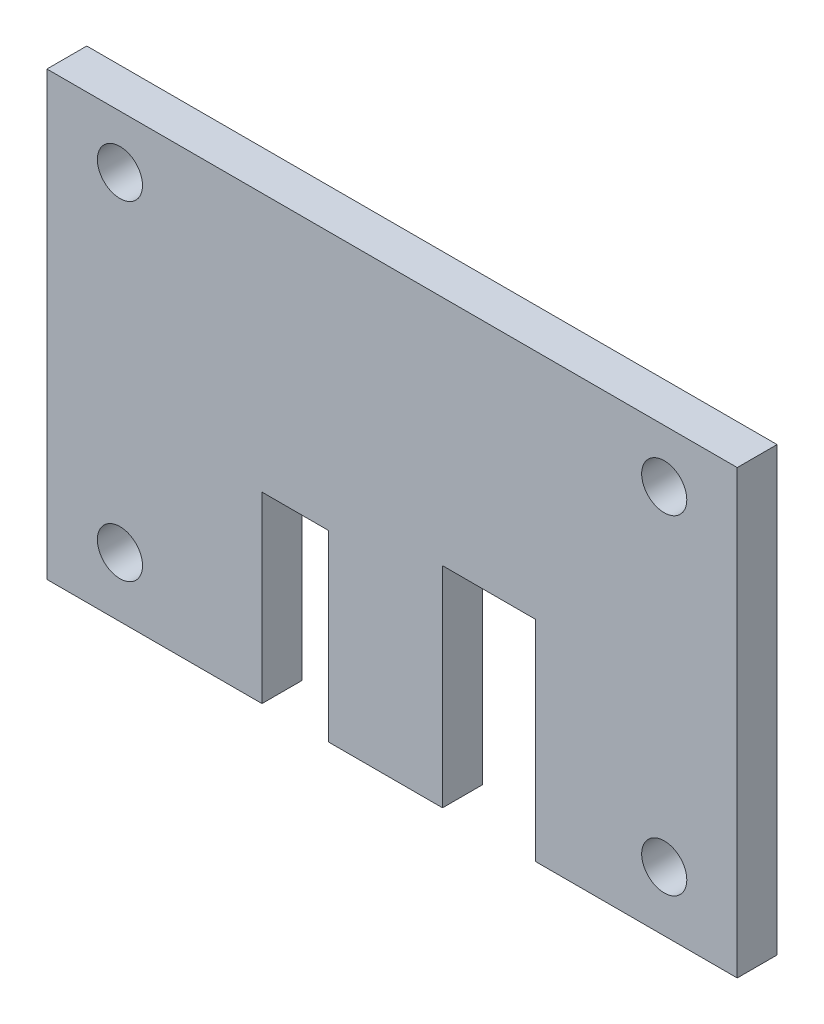
ISO-10303-21;
HEADER;
FILE_DESCRIPTION(('STEP AP214'),'2;1');
FILE_NAME('part.step','',(''),(''),'','','');
FILE_SCHEMA(('AUTOMOTIVE_DESIGN { 1 0 10303 214 1 1 1 1 }'));
ENDSEC;
DATA;
#1=APPLICATION_CONTEXT('core data for automotive mechanical design processes');
#2=APPLICATION_PROTOCOL_DEFINITION('international standard','automotive_design',2000,#1);
#3=PRODUCT_CONTEXT('',#1,'mechanical');
#4=PRODUCT('Part','Part','',(#3));
#5=PRODUCT_RELATED_PRODUCT_CATEGORY('part','',(#4));
#6=PRODUCT_DEFINITION_FORMATION('','',#4);
#7=PRODUCT_DEFINITION_CONTEXT('part definition',#1,'design');
#8=PRODUCT_DEFINITION('design','',#6,#7);
#9=PRODUCT_DEFINITION_SHAPE('','',#8);
#10=(LENGTH_UNIT() NAMED_UNIT(*) SI_UNIT(.MILLI.,.METRE.));
#11=(NAMED_UNIT(*) PLANE_ANGLE_UNIT() SI_UNIT($,.RADIAN.));
#12=(NAMED_UNIT(*) SI_UNIT($,.STERADIAN.) SOLID_ANGLE_UNIT());
#13=UNCERTAINTY_MEASURE_WITH_UNIT(LENGTH_MEASURE(1.E-05),#10,'distance_accuracy_value','');
#14=(GEOMETRIC_REPRESENTATION_CONTEXT(3) GLOBAL_UNCERTAINTY_ASSIGNED_CONTEXT((#13)) GLOBAL_UNIT_ASSIGNED_CONTEXT((#10,
#11,#12)) REPRESENTATION_CONTEXT('',''));
#15=CARTESIAN_POINT('',(0.,0.,0.));
#16=DIRECTION('',(0.,0.,1.));
#17=DIRECTION('',(1.,0.,0.));
#18=AXIS2_PLACEMENT_3D('',#15,#16,#17);
#19=CARTESIAN_POINT('',(-62.5,-26.8,127.4));
#20=DIRECTION('',(0.,1.,0.));
#21=DIRECTION('',(0.,0.,1.));
#22=AXIS2_PLACEMENT_3D('',#19,#20,#21);
#23=PLANE('',#22);
#24=DIRECTION('',(0.,0.,-1.));
#25=VECTOR('',#24,1.);
#26=CARTESIAN_POINT('',(-46.3,-26.8,127.4));
#27=LINE('',#26,#25);
#28=CARTESIAN_POINT('',(-46.3,-26.8,127.4));
#29=VERTEX_POINT('',#28);
#30=CARTESIAN_POINT('',(-46.3,-26.8,124.4));
#31=VERTEX_POINT('',#30);
#32=EDGE_CURVE('E165',#29,#31,#27,.T.);
#33=ORIENTED_EDGE('',*,*,#32,.F.);
#34=DIRECTION('',(1.,0.,0.));
#35=VECTOR('',#34,1.);
#36=CARTESIAN_POINT('',(-62.5,-26.8,127.4));
#37=LINE('',#36,#35);
#38=CARTESIAN_POINT('',(-62.5,-26.8,127.4));
#39=VERTEX_POINT('',#38);
#40=EDGE_CURVE('E176',#39,#29,#37,.T.);
#41=ORIENTED_EDGE('',*,*,#40,.F.);
#42=DIRECTION('',(0.,0.,-1.));
#43=VECTOR('',#42,1.);
#44=CARTESIAN_POINT('',(-62.5,-26.8,127.4));
#45=LINE('',#44,#43);
#46=CARTESIAN_POINT('',(-62.5,-26.8,124.4));
#47=VERTEX_POINT('',#46);
#48=EDGE_CURVE('E201',#39,#47,#45,.T.);
#49=ORIENTED_EDGE('',*,*,#48,.T.);
#50=DIRECTION('',(1.,0.,0.));
#51=VECTOR('',#50,1.);
#52=CARTESIAN_POINT('',(-62.5,-26.8,124.4));
#53=LINE('',#52,#51);
#54=EDGE_CURVE('E186',#47,#31,#53,.T.);
#55=ORIENTED_EDGE('',*,*,#54,.T.);
#56=EDGE_LOOP('',(#33,#41,#49,#55));
#57=FACE_BOUND('',#56,.T.);
#58=ADVANCED_FACE('F39',(#57),#23,.F.);
#59=DIRECTION('',(0.,0.,1.));
#60=VECTOR('',#59,1.);
#61=CARTESIAN_POINT('',(-41.3,-26.8,127.4));
#62=LINE('',#61,#60);
#63=CARTESIAN_POINT('',(-41.3,-26.8,124.4));
#64=VERTEX_POINT('',#63);
#65=CARTESIAN_POINT('',(-41.3,-26.8,127.4));
#66=VERTEX_POINT('',#65);
#67=EDGE_CURVE('E156',#64,#66,#62,.T.);
#68=ORIENTED_EDGE('',*,*,#67,.F.);
#69=CARTESIAN_POINT('',(-32.7,-26.8,124.4));
#70=VERTEX_POINT('',#69);
#71=EDGE_CURVE('E190',#64,#70,#53,.T.);
#72=ORIENTED_EDGE('',*,*,#71,.T.);
#73=DIRECTION('',(0.,0.,-1.));
#74=VECTOR('',#73,1.);
#75=CARTESIAN_POINT('',(-32.7,-26.8,127.4));
#76=LINE('',#75,#74);
#77=CARTESIAN_POINT('',(-32.7,-26.8,127.4));
#78=VERTEX_POINT('',#77);
#79=EDGE_CURVE('E153',#78,#70,#76,.T.);
#80=ORIENTED_EDGE('',*,*,#79,.F.);
#81=EDGE_CURVE('E151',#66,#78,#37,.T.);
#82=ORIENTED_EDGE('',*,*,#81,.F.);
#83=EDGE_LOOP('',(#68,#72,#80,#82));
#84=FACE_BOUND('',#83,.T.);
#85=ADVANCED_FACE('F276',(#84),#23,.F.);
#86=DIRECTION('',(0.,0.,1.));
#87=VECTOR('',#86,1.);
#88=CARTESIAN_POINT('',(-25.7,-26.8,127.4));
#89=LINE('',#88,#87);
#90=CARTESIAN_POINT('',(-25.7,-26.8,124.4));
#91=VERTEX_POINT('',#90);
#92=CARTESIAN_POINT('',(-25.7,-26.8,127.4));
#93=VERTEX_POINT('',#92);
#94=EDGE_CURVE('E135',#91,#93,#89,.T.);
#95=ORIENTED_EDGE('',*,*,#94,.F.);
#96=CARTESIAN_POINT('',(-10.5,-26.8,124.4));
#97=VERTEX_POINT('',#96);
#98=EDGE_CURVE('E185',#91,#97,#53,.T.);
#99=ORIENTED_EDGE('',*,*,#98,.T.);
#100=DIRECTION('',(0.,0.,-1.));
#101=VECTOR('',#100,1.);
#102=CARTESIAN_POINT('',(-10.5,-26.8,127.4));
#103=LINE('',#102,#101);
#104=CARTESIAN_POINT('',(-10.5,-26.8,127.4));
#105=VERTEX_POINT('',#104);
#106=EDGE_CURVE('E198',#105,#97,#103,.T.);
#107=ORIENTED_EDGE('',*,*,#106,.F.);
#108=EDGE_CURVE('E174',#93,#105,#37,.T.);
#109=ORIENTED_EDGE('',*,*,#108,.F.);
#110=EDGE_LOOP('',(#95,#99,#107,#109));
#111=FACE_BOUND('',#110,.T.);
#112=ADVANCED_FACE('F244',(#111),#23,.F.);
#113=CARTESIAN_POINT('',(0.,0.,127.4));
#114=DIRECTION('',(0.,0.,1.));
#115=DIRECTION('',(1.,0.,0.));
#116=AXIS2_PLACEMENT_3D('',#113,#114,#115);
#117=PLANE('',#116);
#118=CARTESIAN_POINT('',(-57.,2.5,127.4));
#119=DIRECTION('',(0.,0.,1.));
#120=DIRECTION('',(1.,0.,0.));
#121=AXIS2_PLACEMENT_3D('',#118,#119,#120);
#122=CIRCLE('',#121,1.7);
#123=CARTESIAN_POINT('',(-55.3,2.5,127.4));
#124=VERTEX_POINT('',#123);
#125=EDGE_CURVE('E232',#124,#124,#122,.F.);
#126=ORIENTED_EDGE('',*,*,#125,.T.);
#127=EDGE_LOOP('',(#126));
#128=FACE_BOUND('',#127,.T.);
#129=CARTESIAN_POINT('',(-16.,-22.3,127.4));
#130=DIRECTION('',(0.,0.,1.));
#131=DIRECTION('',(1.,0.,0.));
#132=AXIS2_PLACEMENT_3D('',#129,#130,#131);
#133=CIRCLE('',#132,1.7);
#134=CARTESIAN_POINT('',(-14.3,-22.3,127.4));
#135=VERTEX_POINT('',#134);
#136=EDGE_CURVE('E221',#135,#135,#133,.F.);
#137=ORIENTED_EDGE('',*,*,#136,.T.);
#138=EDGE_LOOP('',(#137));
#139=FACE_BOUND('',#138,.T.);
#140=CARTESIAN_POINT('',(-16.,2.5,127.4));
#141=DIRECTION('',(0.,0.,1.));
#142=DIRECTION('',(1.,0.,0.));
#143=AXIS2_PLACEMENT_3D('',#140,#141,#142);
#144=CIRCLE('',#143,1.7);
#145=CARTESIAN_POINT('',(-14.3,2.5,127.4));
#146=VERTEX_POINT('',#145);
#147=EDGE_CURVE('E218',#146,#146,#144,.F.);
#148=ORIENTED_EDGE('',*,*,#147,.T.);
#149=EDGE_LOOP('',(#148));
#150=FACE_BOUND('',#149,.T.);
#151=CARTESIAN_POINT('',(-57.,-22.3,127.4));
#152=DIRECTION('',(0.,0.,1.));
#153=DIRECTION('',(1.,0.,0.));
#154=AXIS2_PLACEMENT_3D('',#151,#152,#153);
#155=CIRCLE('',#154,1.7);
#156=CARTESIAN_POINT('',(-55.3,-22.3,127.4));
#157=VERTEX_POINT('',#156);
#158=EDGE_CURVE('E215',#157,#157,#155,.F.);
#159=ORIENTED_EDGE('',*,*,#158,.T.);
#160=EDGE_LOOP('',(#159));
#161=FACE_BOUND('',#160,.T.);
#162=ORIENTED_EDGE('',*,*,#40,.T.);
#163=DIRECTION('',(0.,1.,0.));
#164=VECTOR('',#163,1.);
#165=CARTESIAN_POINT('',(-46.3,0.,127.4));
#166=LINE('',#165,#164);
#167=CARTESIAN_POINT('',(-46.3,-13.,127.4));
#168=VERTEX_POINT('',#167);
#169=EDGE_CURVE('E167',#29,#168,#166,.T.);
#170=ORIENTED_EDGE('',*,*,#169,.T.);
#171=DIRECTION('',(1.,0.,0.));
#172=VECTOR('',#171,1.);
#173=CARTESIAN_POINT('',(0.,-13.,127.4));
#174=LINE('',#173,#172);
#175=CARTESIAN_POINT('',(-41.3,-13.,127.4));
#176=VERTEX_POINT('',#175);
#177=EDGE_CURVE('E152',#168,#176,#174,.T.);
#178=ORIENTED_EDGE('',*,*,#177,.T.);
#179=DIRECTION('',(0.,-1.,0.));
#180=VECTOR('',#179,1.);
#181=CARTESIAN_POINT('',(-41.3,0.,127.4));
#182=LINE('',#181,#180);
#183=EDGE_CURVE('E163',#176,#66,#182,.T.);
#184=ORIENTED_EDGE('',*,*,#183,.T.);
#185=ORIENTED_EDGE('',*,*,#81,.T.);
#186=DIRECTION('',(0.,1.,0.));
#187=VECTOR('',#186,1.);
#188=CARTESIAN_POINT('',(-32.7,0.,127.4));
#189=LINE('',#188,#187);
#190=CARTESIAN_POINT('',(-32.7,-11.,127.4));
#191=VERTEX_POINT('',#190);
#192=EDGE_CURVE('E140',#78,#191,#189,.T.);
#193=ORIENTED_EDGE('',*,*,#192,.T.);
#194=DIRECTION('',(1.,0.,0.));
#195=VECTOR('',#194,1.);
#196=CARTESIAN_POINT('',(0.,-11.,127.4));
#197=LINE('',#196,#195);
#198=CARTESIAN_POINT('',(-25.7,-11.,127.4));
#199=VERTEX_POINT('',#198);
#200=EDGE_CURVE('E128',#191,#199,#197,.T.);
#201=ORIENTED_EDGE('',*,*,#200,.T.);
#202=DIRECTION('',(0.,-1.,0.));
#203=VECTOR('',#202,1.);
#204=CARTESIAN_POINT('',(-25.7,0.,127.4));
#205=LINE('',#204,#203);
#206=EDGE_CURVE('E158',#199,#93,#205,.T.);
#207=ORIENTED_EDGE('',*,*,#206,.T.);
#208=ORIENTED_EDGE('',*,*,#108,.T.);
#209=DIRECTION('',(0.,1.,0.));
#210=VECTOR('',#209,1.);
#211=CARTESIAN_POINT('',(-10.5,-26.8,127.4));
#212=LINE('',#211,#210);
#213=CARTESIAN_POINT('',(-10.5,6.5,127.4));
#214=VERTEX_POINT('',#213);
#215=EDGE_CURVE('E178',#105,#214,#212,.T.);
#216=ORIENTED_EDGE('',*,*,#215,.T.);
#217=DIRECTION('',(-1.,0.,0.));
#218=VECTOR('',#217,1.);
#219=CARTESIAN_POINT('',(-10.5,6.5,127.4));
#220=LINE('',#219,#218);
#221=CARTESIAN_POINT('',(-62.5,6.5,127.4));
#222=VERTEX_POINT('',#221);
#223=EDGE_CURVE('E180',#214,#222,#220,.T.);
#224=ORIENTED_EDGE('',*,*,#223,.T.);
#225=DIRECTION('',(0.,-1.,0.));
#226=VECTOR('',#225,1.);
#227=CARTESIAN_POINT('',(-62.5,6.5,127.4));
#228=LINE('',#227,#226);
#229=EDGE_CURVE('E171',#222,#39,#228,.T.);
#230=ORIENTED_EDGE('',*,*,#229,.T.);
#231=EDGE_LOOP('',(#162,#170,#178,#184,#185,#193,#201,#207,#208,#216,#224,#230));
#232=FACE_BOUND('',#231,.T.);
#233=ADVANCED_FACE('F148',(#128,#139,#150,#161,#232),#117,.T.);
#234=CARTESIAN_POINT('',(0.,0.,124.4));
#235=DIRECTION('',(0.,0.,1.));
#236=DIRECTION('',(1.,0.,0.));
#237=AXIS2_PLACEMENT_3D('',#234,#235,#236);
#238=PLANE('',#237);
#239=CARTESIAN_POINT('',(-57.,2.5,124.4));
#240=DIRECTION('',(0.,0.,1.));
#241=DIRECTION('',(1.,0.,0.));
#242=AXIS2_PLACEMENT_3D('',#239,#240,#241);
#243=CIRCLE('',#242,1.7);
#244=CARTESIAN_POINT('',(-55.3,2.5,124.4));
#245=VERTEX_POINT('',#244);
#246=EDGE_CURVE('E43',#245,#245,#243,.F.);
#247=ORIENTED_EDGE('',*,*,#246,.F.);
#248=EDGE_LOOP('',(#247));
#249=FACE_BOUND('',#248,.T.);
#250=CARTESIAN_POINT('',(-16.,-22.3,124.4));
#251=DIRECTION('',(0.,0.,1.));
#252=DIRECTION('',(1.,0.,0.));
#253=AXIS2_PLACEMENT_3D('',#250,#251,#252);
#254=CIRCLE('',#253,1.7);
#255=CARTESIAN_POINT('',(-14.3,-22.3,124.4));
#256=VERTEX_POINT('',#255);
#257=EDGE_CURVE('E219',#256,#256,#254,.F.);
#258=ORIENTED_EDGE('',*,*,#257,.F.);
#259=EDGE_LOOP('',(#258));
#260=FACE_BOUND('',#259,.T.);
#261=CARTESIAN_POINT('',(-16.,2.5,124.4));
#262=DIRECTION('',(0.,0.,1.));
#263=DIRECTION('',(1.,0.,0.));
#264=AXIS2_PLACEMENT_3D('',#261,#262,#263);
#265=CIRCLE('',#264,1.7);
#266=CARTESIAN_POINT('',(-14.3,2.5,124.4));
#267=VERTEX_POINT('',#266);
#268=EDGE_CURVE('E216',#267,#267,#265,.F.);
#269=ORIENTED_EDGE('',*,*,#268,.F.);
#270=EDGE_LOOP('',(#269));
#271=FACE_BOUND('',#270,.T.);
#272=CARTESIAN_POINT('',(-57.,-22.3,124.4));
#273=DIRECTION('',(0.,0.,1.));
#274=DIRECTION('',(1.,0.,0.));
#275=AXIS2_PLACEMENT_3D('',#272,#273,#274);
#276=CIRCLE('',#275,1.7);
#277=CARTESIAN_POINT('',(-55.3,-22.3,124.4));
#278=VERTEX_POINT('',#277);
#279=EDGE_CURVE('E212',#278,#278,#276,.F.);
#280=ORIENTED_EDGE('',*,*,#279,.F.);
#281=EDGE_LOOP('',(#280));
#282=FACE_BOUND('',#281,.T.);
#283=DIRECTION('',(0.,1.,0.));
#284=VECTOR('',#283,1.);
#285=CARTESIAN_POINT('',(-46.3,0.,124.4));
#286=LINE('',#285,#284);
#287=CARTESIAN_POINT('',(-46.3,-13.,124.4));
#288=VERTEX_POINT('',#287);
#289=EDGE_CURVE('E11',#31,#288,#286,.T.);
#290=ORIENTED_EDGE('',*,*,#289,.F.);
#291=ORIENTED_EDGE('',*,*,#54,.F.);
#292=DIRECTION('',(0.,-1.,0.));
#293=VECTOR('',#292,1.);
#294=CARTESIAN_POINT('',(-62.5,6.5,124.4));
#295=LINE('',#294,#293);
#296=CARTESIAN_POINT('',(-62.5,6.5,124.4));
#297=VERTEX_POINT('',#296);
#298=EDGE_CURVE('E170',#297,#47,#295,.T.);
#299=ORIENTED_EDGE('',*,*,#298,.F.);
#300=DIRECTION('',(-1.,0.,0.));
#301=VECTOR('',#300,1.);
#302=CARTESIAN_POINT('',(-10.5,6.5,124.4));
#303=LINE('',#302,#301);
#304=CARTESIAN_POINT('',(-10.5,6.5,124.4));
#305=VERTEX_POINT('',#304);
#306=EDGE_CURVE('E175',#305,#297,#303,.T.);
#307=ORIENTED_EDGE('',*,*,#306,.F.);
#308=DIRECTION('',(0.,1.,0.));
#309=VECTOR('',#308,1.);
#310=CARTESIAN_POINT('',(-10.5,-26.8,124.4));
#311=LINE('',#310,#309);
#312=EDGE_CURVE('E189',#97,#305,#311,.T.);
#313=ORIENTED_EDGE('',*,*,#312,.F.);
#314=ORIENTED_EDGE('',*,*,#98,.F.);
#315=DIRECTION('',(0.,-1.,0.));
#316=VECTOR('',#315,1.);
#317=CARTESIAN_POINT('',(-25.7,0.,124.4));
#318=LINE('',#317,#316);
#319=CARTESIAN_POINT('',(-25.7,-11.,124.4));
#320=VERTEX_POINT('',#319);
#321=EDGE_CURVE('E206',#320,#91,#318,.T.);
#322=ORIENTED_EDGE('',*,*,#321,.F.);
#323=DIRECTION('',(1.,0.,0.));
#324=VECTOR('',#323,1.);
#325=CARTESIAN_POINT('',(0.,-11.,124.4));
#326=LINE('',#325,#324);
#327=CARTESIAN_POINT('',(-32.7,-11.,124.4));
#328=VERTEX_POINT('',#327);
#329=EDGE_CURVE('E204',#328,#320,#326,.T.);
#330=ORIENTED_EDGE('',*,*,#329,.F.);
#331=DIRECTION('',(0.,1.,0.));
#332=VECTOR('',#331,1.);
#333=CARTESIAN_POINT('',(-32.7,0.,124.4));
#334=LINE('',#333,#332);
#335=EDGE_CURVE('E143',#70,#328,#334,.T.);
#336=ORIENTED_EDGE('',*,*,#335,.F.);
#337=ORIENTED_EDGE('',*,*,#71,.F.);
#338=DIRECTION('',(0.,-1.,0.));
#339=VECTOR('',#338,1.);
#340=CARTESIAN_POINT('',(-41.3,0.,124.4));
#341=LINE('',#340,#339);
#342=CARTESIAN_POINT('',(-41.3,-13.,124.4));
#343=VERTEX_POINT('',#342);
#344=EDGE_CURVE('E48',#343,#64,#341,.T.);
#345=ORIENTED_EDGE('',*,*,#344,.F.);
#346=DIRECTION('',(1.,0.,0.));
#347=VECTOR('',#346,1.);
#348=CARTESIAN_POINT('',(0.,-13.,124.4));
#349=LINE('',#348,#347);
#350=EDGE_CURVE('E209',#288,#343,#349,.T.);
#351=ORIENTED_EDGE('',*,*,#350,.F.);
#352=EDGE_LOOP('',(#290,#291,#299,#307,#313,#314,#322,#330,#336,#337,#345,#351));
#353=FACE_BOUND('',#352,.T.);
#354=ADVANCED_FACE('F268',(#249,#260,#271,#282,#353),#238,.F.);
#355=CARTESIAN_POINT('',(-62.5,6.5,127.4));
#356=DIRECTION('',(1.,0.,0.));
#357=DIRECTION('',(0.,0.,-1.));
#358=AXIS2_PLACEMENT_3D('',#355,#356,#357);
#359=PLANE('',#358);
#360=ORIENTED_EDGE('',*,*,#298,.T.);
#361=ORIENTED_EDGE('',*,*,#48,.F.);
#362=ORIENTED_EDGE('',*,*,#229,.F.);
#363=DIRECTION('',(0.,0.,-1.));
#364=VECTOR('',#363,1.);
#365=CARTESIAN_POINT('',(-62.5,6.5,127.4));
#366=LINE('',#365,#364);
#367=EDGE_CURVE('E182',#222,#297,#366,.T.);
#368=ORIENTED_EDGE('',*,*,#367,.T.);
#369=EDGE_LOOP('',(#360,#361,#362,#368));
#370=FACE_BOUND('',#369,.T.);
#371=ADVANCED_FACE('F41',(#370),#359,.F.);
#372=CARTESIAN_POINT('',(-10.5,-26.8,127.4));
#373=DIRECTION('',(-1.,0.,0.));
#374=DIRECTION('',(0.,0.,1.));
#375=AXIS2_PLACEMENT_3D('',#372,#373,#374);
#376=PLANE('',#375);
#377=ORIENTED_EDGE('',*,*,#312,.T.);
#378=DIRECTION('',(0.,0.,-1.));
#379=VECTOR('',#378,1.);
#380=CARTESIAN_POINT('',(-10.5,6.5,127.4));
#381=LINE('',#380,#379);
#382=EDGE_CURVE('E195',#214,#305,#381,.T.);
#383=ORIENTED_EDGE('',*,*,#382,.F.);
#384=ORIENTED_EDGE('',*,*,#215,.F.);
#385=ORIENTED_EDGE('',*,*,#106,.T.);
#386=EDGE_LOOP('',(#377,#383,#384,#385));
#387=FACE_BOUND('',#386,.T.);
#388=ADVANCED_FACE('F250',(#387),#376,.F.);
#389=CARTESIAN_POINT('',(-10.5,6.5,127.4));
#390=DIRECTION('',(0.,-1.,0.));
#391=DIRECTION('',(0.,0.,-1.));
#392=AXIS2_PLACEMENT_3D('',#389,#390,#391);
#393=PLANE('',#392);
#394=ORIENTED_EDGE('',*,*,#306,.T.);
#395=ORIENTED_EDGE('',*,*,#367,.F.);
#396=ORIENTED_EDGE('',*,*,#223,.F.);
#397=ORIENTED_EDGE('',*,*,#382,.T.);
#398=EDGE_LOOP('',(#394,#395,#396,#397));
#399=FACE_BOUND('',#398,.T.);
#400=ADVANCED_FACE('F256',(#399),#393,.F.);
#401=CARTESIAN_POINT('',(-25.7,-11.,128.4));
#402=DIRECTION('',(0.,-1.,0.));
#403=DIRECTION('',(0.,0.,-1.));
#404=AXIS2_PLACEMENT_3D('',#401,#402,#403);
#405=PLANE('',#404);
#406=DIRECTION('',(0.,0.,-1.));
#407=VECTOR('',#406,1.);
#408=CARTESIAN_POINT('',(-32.7,-11.,128.4));
#409=LINE('',#408,#407);
#410=EDGE_CURVE('E63',#191,#328,#409,.T.);
#411=ORIENTED_EDGE('',*,*,#410,.T.);
#412=ORIENTED_EDGE('',*,*,#329,.T.);
#413=DIRECTION('',(0.,0.,-1.));
#414=VECTOR('',#413,1.);
#415=CARTESIAN_POINT('',(-25.7,-11.,128.4));
#416=LINE('',#415,#414);
#417=EDGE_CURVE('E131',#199,#320,#416,.T.);
#418=ORIENTED_EDGE('',*,*,#417,.F.);
#419=ORIENTED_EDGE('',*,*,#200,.F.);
#420=EDGE_LOOP('',(#411,#412,#418,#419));
#421=FACE_BOUND('',#420,.T.);
#422=ADVANCED_FACE('F129',(#421),#405,.T.);
#423=CARTESIAN_POINT('',(-32.7,-11.,128.4));
#424=DIRECTION('',(1.,0.,0.));
#425=DIRECTION('',(0.,0.,-1.));
#426=AXIS2_PLACEMENT_3D('',#423,#424,#425);
#427=PLANE('',#426);
#428=ORIENTED_EDGE('',*,*,#79,.T.);
#429=ORIENTED_EDGE('',*,*,#335,.T.);
#430=ORIENTED_EDGE('',*,*,#410,.F.);
#431=ORIENTED_EDGE('',*,*,#192,.F.);
#432=EDGE_LOOP('',(#428,#429,#430,#431));
#433=FACE_BOUND('',#432,.T.);
#434=ADVANCED_FACE('F139',(#433),#427,.T.);
#435=CARTESIAN_POINT('',(-25.7,-27.8,128.4));
#436=DIRECTION('',(-1.,0.,0.));
#437=DIRECTION('',(0.,0.,1.));
#438=AXIS2_PLACEMENT_3D('',#435,#436,#437);
#439=PLANE('',#438);
#440=ORIENTED_EDGE('',*,*,#417,.T.);
#441=ORIENTED_EDGE('',*,*,#321,.T.);
#442=ORIENTED_EDGE('',*,*,#94,.T.);
#443=ORIENTED_EDGE('',*,*,#206,.F.);
#444=EDGE_LOOP('',(#440,#441,#442,#443));
#445=FACE_BOUND('',#444,.T.);
#446=ADVANCED_FACE('F279',(#445),#439,.T.);
#447=CARTESIAN_POINT('',(-41.3,-13.,128.4));
#448=DIRECTION('',(0.,-1.,0.));
#449=DIRECTION('',(0.,0.,-1.));
#450=AXIS2_PLACEMENT_3D('',#447,#448,#449);
#451=PLANE('',#450);
#452=DIRECTION('',(0.,0.,-1.));
#453=VECTOR('',#452,1.);
#454=CARTESIAN_POINT('',(-46.3,-13.,128.4));
#455=LINE('',#454,#453);
#456=EDGE_CURVE('E56',#168,#288,#455,.T.);
#457=ORIENTED_EDGE('',*,*,#456,.T.);
#458=ORIENTED_EDGE('',*,*,#350,.T.);
#459=DIRECTION('',(0.,0.,-1.));
#460=VECTOR('',#459,1.);
#461=CARTESIAN_POINT('',(-41.3,-13.,128.4));
#462=LINE('',#461,#460);
#463=EDGE_CURVE('E136',#176,#343,#462,.T.);
#464=ORIENTED_EDGE('',*,*,#463,.F.);
#465=ORIENTED_EDGE('',*,*,#177,.F.);
#466=EDGE_LOOP('',(#457,#458,#464,#465));
#467=FACE_BOUND('',#466,.T.);
#468=ADVANCED_FACE('F271',(#467),#451,.T.);
#469=CARTESIAN_POINT('',(-46.3,-13.,128.4));
#470=DIRECTION('',(1.,0.,0.));
#471=DIRECTION('',(0.,0.,-1.));
#472=AXIS2_PLACEMENT_3D('',#469,#470,#471);
#473=PLANE('',#472);
#474=ORIENTED_EDGE('',*,*,#32,.T.);
#475=ORIENTED_EDGE('',*,*,#289,.T.);
#476=ORIENTED_EDGE('',*,*,#456,.F.);
#477=ORIENTED_EDGE('',*,*,#169,.F.);
#478=EDGE_LOOP('',(#474,#475,#476,#477));
#479=FACE_BOUND('',#478,.T.);
#480=ADVANCED_FACE('F263',(#479),#473,.T.);
#481=CARTESIAN_POINT('',(-41.3,-27.8,128.4));
#482=DIRECTION('',(-1.,0.,0.));
#483=DIRECTION('',(0.,0.,1.));
#484=AXIS2_PLACEMENT_3D('',#481,#482,#483);
#485=PLANE('',#484);
#486=ORIENTED_EDGE('',*,*,#463,.T.);
#487=ORIENTED_EDGE('',*,*,#344,.T.);
#488=ORIENTED_EDGE('',*,*,#67,.T.);
#489=ORIENTED_EDGE('',*,*,#183,.F.);
#490=EDGE_LOOP('',(#486,#487,#488,#489));
#491=FACE_BOUND('',#490,.T.);
#492=ADVANCED_FACE('F273',(#491),#485,.T.);
#493=CARTESIAN_POINT('',(-57.,-22.3,128.4));
#494=DIRECTION('',(0.,0.,-1.));
#495=DIRECTION('',(-1.,0.,0.));
#496=AXIS2_PLACEMENT_3D('',#493,#494,#495);
#497=CYLINDRICAL_SURFACE('',#496,1.7);
#498=ORIENTED_EDGE('',*,*,#158,.F.);
#499=EDGE_LOOP('',(#498));
#500=FACE_BOUND('',#499,.T.);
#501=ORIENTED_EDGE('',*,*,#279,.T.);
#502=EDGE_LOOP('',(#501));
#503=FACE_BOUND('',#502,.T.);
#504=ADVANCED_FACE('F390',(#500,#503),#497,.F.);
#505=CARTESIAN_POINT('',(-16.,2.5,128.4));
#506=DIRECTION('',(0.,0.,-1.));
#507=DIRECTION('',(-1.,0.,0.));
#508=AXIS2_PLACEMENT_3D('',#505,#506,#507);
#509=CYLINDRICAL_SURFACE('',#508,1.7);
#510=ORIENTED_EDGE('',*,*,#147,.F.);
#511=EDGE_LOOP('',(#510));
#512=FACE_BOUND('',#511,.T.);
#513=ORIENTED_EDGE('',*,*,#268,.T.);
#514=EDGE_LOOP('',(#513));
#515=FACE_BOUND('',#514,.T.);
#516=ADVANCED_FACE('F398',(#512,#515),#509,.F.);
#517=CARTESIAN_POINT('',(-16.,-22.3,128.4));
#518=DIRECTION('',(0.,0.,-1.));
#519=DIRECTION('',(-1.,0.,0.));
#520=AXIS2_PLACEMENT_3D('',#517,#518,#519);
#521=CYLINDRICAL_SURFACE('',#520,1.7);
#522=ORIENTED_EDGE('',*,*,#136,.F.);
#523=EDGE_LOOP('',(#522));
#524=FACE_BOUND('',#523,.T.);
#525=ORIENTED_EDGE('',*,*,#257,.T.);
#526=EDGE_LOOP('',(#525));
#527=FACE_BOUND('',#526,.T.);
#528=ADVANCED_FACE('F408',(#524,#527),#521,.F.);
#529=CARTESIAN_POINT('',(-57.,2.5,128.4));
#530=DIRECTION('',(0.,0.,-1.));
#531=DIRECTION('',(-1.,0.,0.));
#532=AXIS2_PLACEMENT_3D('',#529,#530,#531);
#533=CYLINDRICAL_SURFACE('',#532,1.7);
#534=ORIENTED_EDGE('',*,*,#125,.F.);
#535=EDGE_LOOP('',(#534));
#536=FACE_BOUND('',#535,.T.);
#537=ORIENTED_EDGE('',*,*,#246,.T.);
#538=EDGE_LOOP('',(#537));
#539=FACE_BOUND('',#538,.T.);
#540=ADVANCED_FACE('F418',(#536,#539),#533,.F.);
#541=CLOSED_SHELL('',(#58,#85,#112,#233,#354,#371,#388,#400,#422,#434,#446,#468,#480,#492,#504,
#516,#528,#540));
#542=MANIFOLD_SOLID_BREP('B2',#541);
#543=ADVANCED_BREP_SHAPE_REPRESENTATION('',(#18,#542),#14);
#544=SHAPE_DEFINITION_REPRESENTATION(#9,#543);
ENDSEC;
END-ISO-10303-21;
